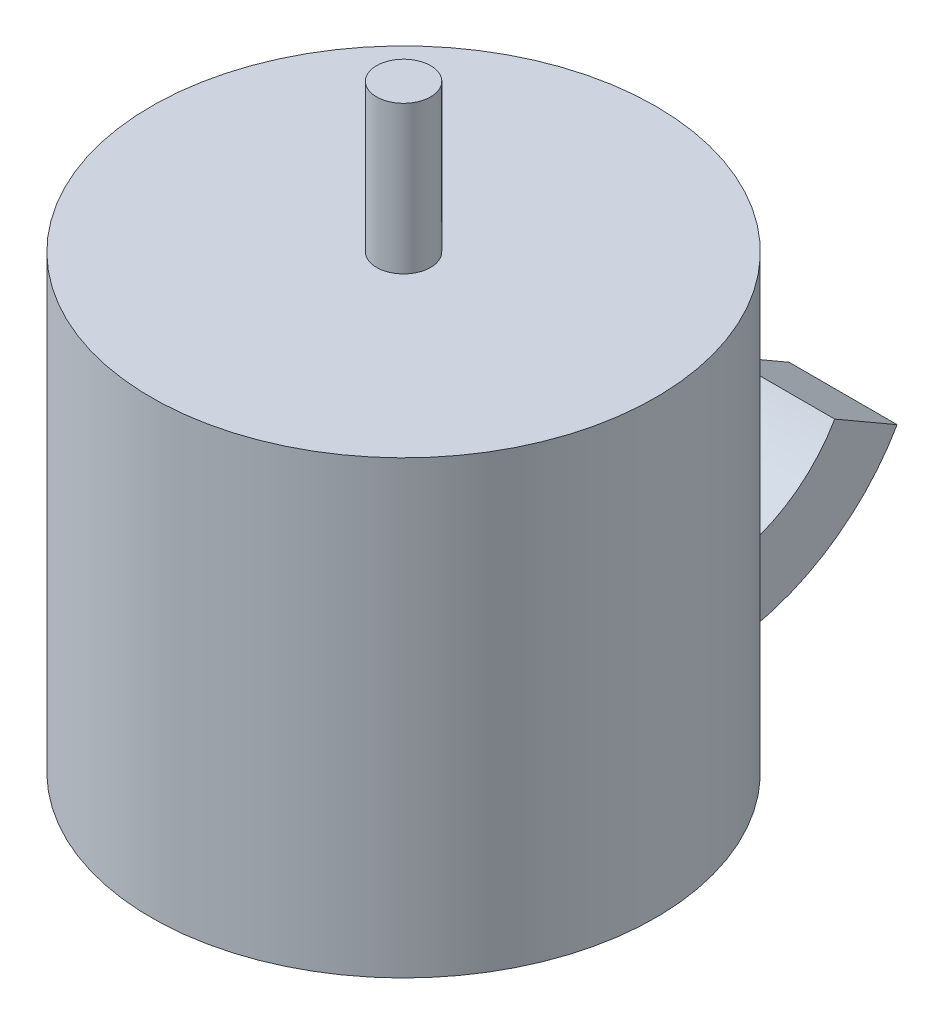
ISO-10303-21;
HEADER;
FILE_DESCRIPTION(('STEP AP214'),'2;1');
FILE_NAME('part.step','',(''),(''),'','','');
FILE_SCHEMA(('AUTOMOTIVE_DESIGN { 1 0 10303 214 1 1 1 1 }'));
ENDSEC;
DATA;
#1=APPLICATION_CONTEXT('core data for automotive mechanical design processes');
#2=APPLICATION_PROTOCOL_DEFINITION('international standard','automotive_design',2000,#1);
#3=PRODUCT_CONTEXT('',#1,'mechanical');
#4=PRODUCT('Part','Part','',(#3));
#5=PRODUCT_RELATED_PRODUCT_CATEGORY('part','',(#4));
#6=PRODUCT_DEFINITION_FORMATION('','',#4);
#7=PRODUCT_DEFINITION_CONTEXT('part definition',#1,'design');
#8=PRODUCT_DEFINITION('design','',#6,#7);
#9=PRODUCT_DEFINITION_SHAPE('','',#8);
#10=(LENGTH_UNIT() NAMED_UNIT(*) SI_UNIT(.MILLI.,.METRE.));
#11=(NAMED_UNIT(*) PLANE_ANGLE_UNIT() SI_UNIT($,.RADIAN.));
#12=(NAMED_UNIT(*) SI_UNIT($,.STERADIAN.) SOLID_ANGLE_UNIT());
#13=UNCERTAINTY_MEASURE_WITH_UNIT(LENGTH_MEASURE(1.E-05),#10,'distance_accuracy_value','');
#14=(GEOMETRIC_REPRESENTATION_CONTEXT(3) GLOBAL_UNCERTAINTY_ASSIGNED_CONTEXT((#13)) GLOBAL_UNIT_ASSIGNED_CONTEXT((#10,
#11,#12)) REPRESENTATION_CONTEXT('',''));
#15=CARTESIAN_POINT('',(0.,0.,0.));
#16=DIRECTION('',(0.,0.,1.));
#17=DIRECTION('',(1.,0.,0.));
#18=AXIS2_PLACEMENT_3D('',#15,#16,#17);
#19=CARTESIAN_POINT('',(0.,-74.4600238629983,0.));
#20=DIRECTION('',(0.,-1.,0.));
#21=DIRECTION('',(0.,0.,-1.));
#22=AXIS2_PLACEMENT_3D('',#19,#20,#21);
#23=CYLINDRICAL_SURFACE('',#22,7.);
#24=CARTESIAN_POINT('',(0.,12.5,0.));
#25=DIRECTION('',(0.,-1.,0.));
#26=DIRECTION('',(0.,0.,-1.));
#27=AXIS2_PLACEMENT_3D('',#24,#25,#26);
#28=CIRCLE('',#27,7.);
#29=CARTESIAN_POINT('',(0.,12.5,-7.));
#30=VERTEX_POINT('',#29);
#31=EDGE_CURVE('E188',#30,#30,#28,.T.);
#32=ORIENTED_EDGE('',*,*,#31,.T.);
#33=EDGE_LOOP('',(#32));
#34=FACE_BOUND('',#33,.T.);
#35=DIRECTION('',(0.,-1.,0.));
#36=VECTOR('',#35,1.);
#37=CARTESIAN_POINT('',(-1.50000000000001,-74.4600238629983,-6.83739716558867));
#38=LINE('',#37,#36);
#39=CARTESIAN_POINT('',(-1.5,0.00220371150858566,-6.83739716558867));
#40=VERTEX_POINT('',#39);
#41=CARTESIAN_POINT('',(-1.5,2.00330632669435,-6.83739716558867));
#42=VERTEX_POINT('',#41);
#43=EDGE_CURVE('E11',#40,#42,#38,.F.);
#44=ORIENTED_EDGE('',*,*,#43,.F.);
#45=CARTESIAN_POINT('',(0.,0.,-7.));
#46=CARTESIAN_POINT('',(-0.126160889957548,1.15670884863326E-05,-7.00000330281107));
#47=CARTESIAN_POINT('',(-0.252321405636509,-1.31835540449459E-08,-6.99658930692439));
#48=CARTESIAN_POINT('',(-0.503907516462989,1.74283427631537E-05,-6.98297141646527));
#49=CARTESIAN_POINT('',(-0.629334181886882,4.63321901920177E-05,-6.97278729209866));
#50=CARTESIAN_POINT('',(-0.87945634818018,0.000230697698201183,-6.94567351132282));
#51=CARTESIAN_POINT('',(-1.0041518487763,0.000386159406082058,-6.92874385239247));
#52=CARTESIAN_POINT('',(-1.25281128850812,0.00101116574864973,-6.88813414517374));
#53=CARTESIAN_POINT('',(-1.37677203385405,0.00148162498386925,-6.86443455550131));
#54=CARTESIAN_POINT('',(-1.5,0.00220371150858536,-6.83739716558867));
#55=B_SPLINE_CURVE_WITH_KNOTS('',3,(#45,#46,#47,#48,#49,#50,#51,#52,#53,#54),.UNSPECIFIED.,.F.,
.F.,(4,2,2,2,4),(0.,0.37843587985044,0.755771473218785,1.1331072076151,1.5115433212298),.UNSPECIFIED.);
#56=CARTESIAN_POINT('',(0.,0.,-7.));
#57=VERTEX_POINT('',#56);
#58=EDGE_CURVE('E160',#57,#40,#55,.T.);
#59=ORIENTED_EDGE('',*,*,#58,.F.);
#60=CARTESIAN_POINT('',(0.,0.,0.));
#61=DIRECTION('',(0.,-1.,0.));
#62=DIRECTION('',(0.,0.,-1.));
#63=AXIS2_PLACEMENT_3D('',#60,#61,#62);
#64=CIRCLE('',#63,7.);
#65=EDGE_CURVE('E208',#57,#57,#64,.T.);
#66=ORIENTED_EDGE('',*,*,#65,.F.);
#67=CARTESIAN_POINT('',(1.5,0.00220371150858479,-6.83739716558867));
#68=CARTESIAN_POINT('',(1.37677203385405,0.00148162498386977,-6.86443455550131));
#69=CARTESIAN_POINT('',(1.25281128850812,0.00101116574865044,-6.88813414517374));
#70=CARTESIAN_POINT('',(1.0041518487763,0.000386159406082552,-6.92874385239247));
#71=CARTESIAN_POINT('',(0.879456348180179,0.000230697698201269,-6.94567351132282));
#72=CARTESIAN_POINT('',(0.629334181886882,4.63321901918761E-05,-6.97278729209866));
#73=CARTESIAN_POINT('',(0.503907516462989,1.74283427631927E-05,-6.98297141646527));
#74=CARTESIAN_POINT('',(0.252321405636509,-1.31835536504651E-08,-6.99658930692439));
#75=CARTESIAN_POINT('',(0.126160889957548,1.15670884869019E-05,-7.00000330281107));
#76=CARTESIAN_POINT('',(0.,0.,-7.));
#77=B_SPLINE_CURVE_WITH_KNOTS('',3,(#67,#68,#69,#70,#71,#72,#73,#74,#75,#76),.UNSPECIFIED.,.F.,
.F.,(4,2,2,2,4),(0.,0.378436113614695,0.755771848011013,1.13310744137936,1.5115433212298),.UNSPECIFIED.);
#78=CARTESIAN_POINT('',(1.5,0.00220371150858479,-6.83739716558867));
#79=VERTEX_POINT('',#78);
#80=EDGE_CURVE('E120',#79,#57,#77,.T.);
#81=ORIENTED_EDGE('',*,*,#80,.F.);
#82=DIRECTION('',(0.,-1.,0.));
#83=VECTOR('',#82,1.);
#84=CARTESIAN_POINT('',(1.49999999999999,-74.4600238629983,-6.83739716558867));
#85=LINE('',#84,#83);
#86=CARTESIAN_POINT('',(1.5,2.00330632669435,-6.83739716558867));
#87=VERTEX_POINT('',#86);
#88=EDGE_CURVE('E68',#87,#79,#85,.T.);
#89=ORIENTED_EDGE('',*,*,#88,.F.);
#90=CARTESIAN_POINT('',(0.,10.,-7.));
#91=CARTESIAN_POINT('',(-0.168772809164749,10.0000005523878,-6.99999984996591));
#92=CARTESIAN_POINT('',(-0.337550551885274,10.0000141547519,-6.99389327636672));
#93=CARTESIAN_POINT('',(-0.674265763692597,9.99990207124392,-6.96949555824698));
#94=CARTESIAN_POINT('',(-0.842202993792885,9.99977634779153,-6.95120112683901));
#95=CARTESIAN_POINT('',(-1.17674598996997,9.99888504702296,-6.90245706066643));
#96=CARTESIAN_POINT('',(-1.34334723292399,9.99811782842839,-6.87197635155625));
#97=CARTESIAN_POINT('',(-1.673887815772,9.99511432403658,-6.79902553788022));
#98=CARTESIAN_POINT('',(-1.83782713669321,9.99287802777324,-6.75655534789935));
#99=CARTESIAN_POINT('',(-2.1888438800098,9.9852259173658,-6.65190062316687));
#100=CARTESIAN_POINT('',(-2.3752924999108,9.97934768400213,-6.58762255999807));
#101=CARTESIAN_POINT('',(-2.74194036904101,9.96178302751718,-6.44364475228686));
#102=CARTESIAN_POINT('',(-2.92213771116011,9.95009484830832,-6.36394034950031));
#103=CARTESIAN_POINT('',(-3.27418950506392,9.91815686491337,-6.19016373018162));
#104=CARTESIAN_POINT('',(-3.44606227024012,9.89792690373791,-6.09612513423304));
#105=CARTESIAN_POINT('',(-3.77999134233663,9.84571116190549,-5.89487771327176));
#106=CARTESIAN_POINT('',(-3.94205450972676,9.81373371028822,-5.78767825515429));
#107=CARTESIAN_POINT('',(-4.19593695160709,9.74936542142401,-5.60434634186958));
#108=CARTESIAN_POINT('',(-4.2913780238917,9.72159283591099,-5.53157082818056));
#109=CARTESIAN_POINT('',(-4.47704370516182,9.65922215541297,-5.38240096914678));
#110=CARTESIAN_POINT('',(-4.5672699419445,9.62462620536475,-5.30600776674888));
#111=CARTESIAN_POINT('',(-4.74189416345373,9.54781904251485,-5.15054346502124));
#112=CARTESIAN_POINT('',(-4.82629597852007,9.50561290171669,-5.07147417757483));
#113=CARTESIAN_POINT('',(-4.9887846836766,9.41286101166235,-4.91172128252504));
#114=CARTESIAN_POINT('',(-5.06687141849854,9.36231505744884,-4.83103763529037));
#115=CARTESIAN_POINT('',(-5.21694708970535,9.25181540608862,-4.66859804245883));
#116=CARTESIAN_POINT('',(-5.28886979917148,9.19177550755227,-4.5868392697734));
#117=CARTESIAN_POINT('',(-5.42535280778977,9.06233734701786,-4.42456649900271));
#118=CARTESIAN_POINT('',(-5.48991301490353,8.99293896805339,-4.34405251648941));
#119=CARTESIAN_POINT('',(-5.61138536949135,8.84480681478384,-4.18596355494664));
#120=CARTESIAN_POINT('',(-5.66830085338458,8.76607714140159,-4.10838730447479));
#121=CARTESIAN_POINT('',(-5.77443655333256,8.59956808157239,-3.95782374202753));
#122=CARTESIAN_POINT('',(-5.82365796851811,8.5117901088606,-3.88483571603344));
#123=CARTESIAN_POINT('',(-5.90803152317441,8.34094164168165,-3.75503346261375));
#124=CARTESIAN_POINT('',(-5.94418903911417,8.25898764712803,-3.697397695684));
#125=CARTESIAN_POINT('',(-6.01110202931933,8.08941227346083,-3.58758792374416));
#126=CARTESIAN_POINT('',(-6.0418578631146,8.00179127206837,-3.53541355532301));
#127=CARTESIAN_POINT('',(-6.09818891404238,7.82152918171838,-3.43733799969686));
#128=CARTESIAN_POINT('',(-6.12376452611626,7.72888847614743,-3.3914363343463));
#129=CARTESIAN_POINT('',(-6.16999694206009,7.53929775646137,-3.3065804590856));
#130=CARTESIAN_POINT('',(-6.19065379525103,7.44234778556735,-3.26762617951418));
#131=CARTESIAN_POINT('',(-6.22627030092859,7.25051571862743,-3.19921238735152));
#132=CARTESIAN_POINT('',(-6.24148660807612,7.15582814510278,-3.16933970541553));
#133=CARTESIAN_POINT('',(-6.26798277675507,6.9639460871109,-3.1166109555411));
#134=CARTESIAN_POINT('',(-6.27926135077155,6.86675079383254,-3.09375718285869));
#135=CARTESIAN_POINT('',(-6.29803878641153,6.67061211013733,-3.05535017342798));
#136=CARTESIAN_POINT('',(-6.3055391963961,6.57166945305753,-3.03979394619136));
#137=CARTESIAN_POINT('',(-6.31688995211207,6.37265266573861,-3.01613557719128));
#138=CARTESIAN_POINT('',(-6.32073893824398,6.27257812807009,-3.00803621200683));
#139=CARTESIAN_POINT('',(-6.32486217263997,6.07127711695942,-2.99935694565199));
#140=CARTESIAN_POINT('',(-6.32510938643477,5.97004763390633,-2.99883391167974));
#141=CARTESIAN_POINT('',(-6.32196332397574,5.76785928984963,-3.00546053966504));
#142=CARTESIAN_POINT('',(-6.31856869858216,5.66690054303616,-3.01261304506951));
#143=CARTESIAN_POINT('',(-6.30808034662417,5.46603745278453,-3.03451304153055));
#144=CARTESIAN_POINT('',(-6.30098784091764,5.36613277244508,-3.0492580259048));
#145=CARTESIAN_POINT('',(-6.28298454883971,5.16801760772482,-3.08618318842767));
#146=CARTESIAN_POINT('',(-6.27207236251411,5.06980775838479,-3.10836609252851));
#147=CARTESIAN_POINT('',(-6.24623053928531,4.87557762166069,-3.15997439440508));
#148=CARTESIAN_POINT('',(-6.23129076690767,4.77956353042713,-3.18941804779068));
#149=CARTESIAN_POINT('',(-6.19719439477318,4.59064581925614,-3.25517321828433));
#150=CARTESIAN_POINT('',(-6.17803624262658,4.49774335895683,-3.29148726304443));
#151=CARTESIAN_POINT('',(-6.13529237147301,4.31581357037366,-3.37048980417808));
#152=CARTESIAN_POINT('',(-6.11170931515018,4.22678395109217,-3.41317446389335));
#153=CARTESIAN_POINT('',(-6.05987452801622,4.05314186814785,-3.50437905964681));
#154=CARTESIAN_POINT('',(-6.03162111992607,3.96853100582602,-3.55290109036908));
#155=CARTESIAN_POINT('',(-5.97056729585278,3.80519451655666,-3.65455850145683));
#156=CARTESIAN_POINT('',(-5.93781788546951,3.72641630552033,-3.70763993092709));
#157=CARTESIAN_POINT('',(-5.86740632187949,3.57423398626466,-3.81809467948091));
#158=CARTESIAN_POINT('',(-5.82974240895437,3.50083181779502,-3.87546953274178));
#159=CARTESIAN_POINT('',(-5.7092409383548,3.28937457334866,-4.05276230122807));
#160=CARTESIAN_POINT('',(-5.61882444931914,3.15988007783073,-4.1779682734395));
#161=CARTESIAN_POINT('',(-5.41672046314013,2.92396708515994,-4.43694633108023));
#162=CARTESIAN_POINT('',(-5.30474894744552,2.81790266716967,-4.57081486283657));
#163=CARTESIAN_POINT('',(-5.06176698474049,2.63032819153592,-4.83850750331308));
#164=CARTESIAN_POINT('',(-4.93074809106439,2.5488290770498,-4.97233156578578));
#165=CARTESIAN_POINT('',(-4.69575386245833,2.42995759281295,-5.19299873226129));
#166=CARTESIAN_POINT('',(-4.59612723856624,2.38675513581029,-5.28145128090713));
#167=CARTESIAN_POINT('',(-4.38982481372099,2.30957740553871,-5.4541281492338));
#168=CARTESIAN_POINT('',(-4.28314685325305,2.2756049754528,-5.53835115956571));
#169=CARTESIAN_POINT('',(-4.06342357269252,2.21561994416554,-5.70152260423284));
#170=CARTESIAN_POINT('',(-3.95036738242325,2.18962144949935,-5.78046149993905));
#171=CARTESIAN_POINT('',(-3.71882151430317,2.14438111517804,-5.93207629813578));
#172=CARTESIAN_POINT('',(-3.60033050884157,2.12514093648244,-6.0047506577138));
#173=CARTESIAN_POINT('',(-3.32225591333481,2.08723110520538,-6.16404331215554));
#174=CARTESIAN_POINT('',(-3.16103920963419,2.07047650136484,-6.24827401619739));
#175=CARTESIAN_POINT('',(-2.83205777694117,2.04384485468282,-6.40410870504731));
#176=CARTESIAN_POINT('',(-2.66429116741512,2.03396980258363,-6.47570903051862));
#177=CARTESIAN_POINT('',(-2.32344710956082,2.01894678323747,-6.60566960063745));
#178=CARTESIAN_POINT('',(-2.1503678636704,2.01380043460841,-6.66402530655725));
#179=CARTESIAN_POINT('',(-1.80014349569399,2.00645577417953,-6.76703794245753));
#180=CARTESIAN_POINT('',(-1.62299868987033,2.00425723385326,-6.8116959341352));
#181=CARTESIAN_POINT('',(-1.26323564996585,2.00139761891136,-6.8875616339982));
#182=CARTESIAN_POINT('',(-1.08057547229369,2.00075861465147,-6.9185712285826));
#183=CARTESIAN_POINT('',(-0.713370386014866,2.00007393756126,-6.96601584692984));
#184=CARTESIAN_POINT('',(-0.528825454967305,2.00002827180383,-6.98245069695277));
#185=CARTESIAN_POINT('',(-0.159012843766465,1.99998959399869,-7.0006418964186));
#186=CARTESIAN_POINT('',(0.0262548355848166,1.99999658189258,-7.00239826214484));
#187=CARTESIAN_POINT('',(0.396347311583818,2.00000596191504,-6.99122197799655));
#188=CARTESIAN_POINT('',(0.581172099747225,2.00000835395625,-6.97828904894325));
#189=CARTESIAN_POINT('',(0.960809482976416,2.00044491304537,-6.93653858746798));
#190=CARTESIAN_POINT('',(1.15551842475297,2.00090625020397,-6.90677238999273));
#191=CARTESIAN_POINT('',(1.54175507180937,2.00339461138826,-6.8309390527949));
#192=CARTESIAN_POINT('',(1.73328233425758,2.00542185152462,-6.78486966354022));
#193=CARTESIAN_POINT('',(2.11171900437515,2.0127126373691,-6.67677825585862));
#194=CARTESIAN_POINT('',(2.29862853839762,2.01797609442364,-6.61475667445638));
#195=CARTESIAN_POINT('',(2.66633786844443,2.03394425583584,-6.47528185089832));
#196=CARTESIAN_POINT('',(2.84713946423919,2.04464734216731,-6.39783320171095));
#197=CARTESIAN_POINT('',(3.15823094660273,2.07062777904778,-6.2488172721431));
#198=CARTESIAN_POINT('',(3.29016143847929,2.08417272347834,-6.18035792856145));
#199=CARTESIAN_POINT('',(3.54882270399237,2.11730181790047,-6.0355454725629));
#200=CARTESIAN_POINT('',(3.6755546128963,2.13688464129793,-5.95919409656693));
#201=CARTESIAN_POINT('',(3.92277858413732,2.18351565384184,-5.79943391371322));
#202=CARTESIAN_POINT('',(4.0432804814258,2.21055162148795,-5.71603681422296));
#203=CARTESIAN_POINT('',(4.27731243981863,2.27362741669522,-5.54308097754108));
#204=CARTESIAN_POINT('',(4.39084420320695,2.30966503483921,-5.45352375622822));
#205=CARTESIAN_POINT('',(4.58595963419521,2.38319930274952,-5.28975152176345));
#206=CARTESIAN_POINT('',(4.66909832931066,2.41865141356751,-5.21646712611937));
#207=CARTESIAN_POINT('',(4.83002724780604,2.49661171903676,-5.06782250781644));
#208=CARTESIAN_POINT('',(4.90781878026242,2.53911817790013,-4.99246279960278));
#209=CARTESIAN_POINT('',(5.05759054134707,2.63173348128945,-4.84067591868955));
#210=CARTESIAN_POINT('',(5.12957232939836,2.68184027530382,-4.7642490389389));
#211=CARTESIAN_POINT('',(5.26734740997393,2.79006642456735,-4.61146746346632));
#212=CARTESIAN_POINT('',(5.33314063578951,2.848185866171,-4.53511276853127));
#213=CARTESIAN_POINT('',(5.45867798042796,2.9730882044983,-4.38321955733735));
#214=CARTESIAN_POINT('',(5.5183750175111,3.03993059653146,-4.30769090796679));
#215=CARTESIAN_POINT('',(5.63098311076777,3.18191764058279,-4.15941091786286));
#216=CARTESIAN_POINT('',(5.68389403874544,3.25706244939139,-4.08665962961464));
#217=CARTESIAN_POINT('',(5.78287332102291,3.41535449756689,-3.94535420975129));
#218=CARTESIAN_POINT('',(5.82894289449713,3.49850030674002,-3.87679933159128));
#219=CARTESIAN_POINT('',(5.91434678637656,3.6722827305267,-3.74521795222048));
#220=CARTESIAN_POINT('',(5.9536818250698,3.76291854251224,-3.68219086014083));
#221=CARTESIAN_POINT('',(6.02158441096636,3.93985913053765,-3.56991678782821));
#222=CARTESIAN_POINT('',(6.05087472223495,4.02541408938187,-3.51992127116284));
#223=CARTESIAN_POINT('',(6.10461404718473,4.20122973865337,-3.42587549960009));
#224=CARTESIAN_POINT('',(6.12906141051524,4.2914920200222,-3.38182727300717));
#225=CARTESIAN_POINT('',(6.17332737249153,4.47598842038671,-3.30033033310824));
#226=CARTESIAN_POINT('',(6.19314803351989,4.57022074751073,-3.26287868117057));
#227=CARTESIAN_POINT('',(6.22842100105837,4.76202680152655,-3.19503295673134));
#228=CARTESIAN_POINT('',(6.24387167506157,4.85960176191349,-3.16464152248822));
#229=CARTESIAN_POINT('',(6.27023833616245,5.05455210989368,-3.11206552157358));
#230=CARTESIAN_POINT('',(6.28126924336509,5.15185649748228,-3.0896748792314));
#231=CARTESIAN_POINT('',(6.29956973692769,5.34824518189995,-3.05218888951007));
#232=CARTESIAN_POINT('',(6.3068379746319,5.44733010377829,-3.03709615805293));
#233=CARTESIAN_POINT('',(6.31772233974805,5.64651459915549,-3.01438935313325));
#234=CARTESIAN_POINT('',(6.32133979531289,5.74661379026797,-3.00677255995543));
#235=CARTESIAN_POINT('',(6.3249888828364,5.94720359844023,-2.99908882415688));
#236=CARTESIAN_POINT('',(6.32501918276018,6.04769434704701,-2.99902468609813));
#237=CARTESIAN_POINT('',(6.32147396974647,6.24930942565156,-3.00649035831947));
#238=CARTESIAN_POINT('',(6.31786339397884,6.35043041565752,-3.01409401198577));
#239=CARTESIAN_POINT('',(6.30691947811082,6.55164267921867,-3.03692717731206));
#240=CARTESIAN_POINT('',(6.29958475424925,6.65173355590625,-3.0521595234946));
#241=CARTESIAN_POINT('',(6.28107430239278,6.85009429763081,-3.09007278450548));
#242=CARTESIAN_POINT('',(6.26990006154306,6.94836485221754,-3.11275081527474));
#243=CARTESIAN_POINT('',(6.24353558458578,7.14245042663586,-3.16530050110784));
#244=CARTESIAN_POINT('',(6.22834388541416,7.2382645379158,-3.19517477652119));
#245=CARTESIAN_POINT('',(6.19376712402429,7.42653858990994,-3.26169428520393));
#246=CARTESIAN_POINT('',(6.17438980744516,7.51900436266206,-3.29832699371624));
#247=CARTESIAN_POINT('',(6.13120586083118,7.70010844340895,-3.37792309522866));
#248=CARTESIAN_POINT('',(6.10739761425969,7.7887453399265,-3.42088879750173));
#249=CARTESIAN_POINT('',(6.02899529846044,8.04782591072821,-3.55841986448443));
#250=CARTESIAN_POINT('',(5.96737791883721,8.21169922598377,-3.66171252133693));
#251=CARTESIAN_POINT('',(5.82476247358577,8.51574387645708,-3.88450692980079));
#252=CARTESIAN_POINT('',(5.74395350500645,8.65612500925767,-4.00384588603544));
#253=CARTESIAN_POINT('',(5.56223288460265,8.91275783541776,-4.25267573734221));
#254=CARTESIAN_POINT('',(5.46131999895083,9.02900804690807,-4.38216725520631));
#255=CARTESIAN_POINT('',(5.23666827946784,9.24042847265061,-4.64850695467395));
#256=CARTESIAN_POINT('',(5.11229034465964,9.33478400902132,-4.78545719405365));
#257=CARTESIAN_POINT('',(4.84509355614454,9.49931630274559,-5.05580826580838));
#258=CARTESIAN_POINT('',(4.70226614634728,9.56948178602846,-5.18920741650062));
#259=CARTESIAN_POINT('',(4.44309469308645,9.67229187623547,-5.41104590518801));
#260=CARTESIAN_POINT('',(4.3304940952223,9.7099426075955,-5.50163708473976));
#261=CARTESIAN_POINT('',(4.09810433817893,9.77598445472761,-5.67685692994023));
#262=CARTESIAN_POINT('',(3.9783125788607,9.80437219707344,-5.76148341456966));
#263=CARTESIAN_POINT('',(3.73225566121129,9.85345664348534,-5.9238551599951));
#264=CARTESIAN_POINT('',(3.60597569221503,9.874134772638,-6.00158346224706));
#265=CARTESIAN_POINT('',(3.34808896969933,9.9092008794314,-6.14917720027492));
#266=CARTESIAN_POINT('',(3.21648223176186,9.92358887547067,-6.21904265904908));
#267=CARTESIAN_POINT('',(2.91301331194685,9.95064515163397,-6.36788941305695));
#268=CARTESIAN_POINT('',(2.73977205268439,9.96183263413111,-6.44433620292907));
#269=CARTESIAN_POINT('',(2.38740461103326,9.97882022106839,-6.58302191277532));
#270=CARTESIAN_POINT('',(2.20827643328357,9.98461847892831,-6.64525595734609));
#271=CARTESIAN_POINT('',(1.84577675747337,9.99286284723879,-6.75491765371547));
#272=CARTESIAN_POINT('',(1.66241215642296,9.99531406274649,-6.8023677690966));
#273=CARTESIAN_POINT('',(1.29250961431407,9.99846642762964,-6.88223808344377));
#274=CARTESIAN_POINT('',(1.10597320007938,9.99916839630352,-6.91466531291442));
#275=CARTESIAN_POINT('',(0.766213652265961,9.99984568738104,-6.95963396342215));
#276=CARTESIAN_POINT('',(0.613328312175802,9.9999329061136,-6.97476942380454));
#277=CARTESIAN_POINT('',(0.306963129006843,10.0000097879729,-6.99495010347015));
#278=CARTESIAN_POINT('',(0.153483604592208,9.9999994976533,-7.00000013644244));
#279=CARTESIAN_POINT('',(0.,10.,-7.));
#280=B_SPLINE_CURVE_WITH_KNOTS('',3,(#90,#91,#92,#93,#94,#95,#96,#97,#98,#99,#100,#101,#102,
#103,#104,#105,#106,#107,#108,#109,#110,#111,#112,#113,#114,#115,#116,#117,#118,#119,#120,#121,
#122,#123,#124,#125,#126,#127,#128,#129,#130,#131,#132,#133,#134,#135,#136,#137,#138,#139,#140,
#141,#142,#143,#144,#145,#146,#147,#148,#149,#150,#151,#152,#153,#154,#155,#156,#157,#158,#159,
#160,#161,#162,#163,#164,#165,#166,#167,#168,#169,#170,#171,#172,#173,#174,#175,#176,#177,#178,
#179,#180,#181,#182,#183,#184,#185,#186,#187,#188,#189,#190,#191,#192,#193,#194,#195,#196,#197,
#198,#199,#200,#201,#202,#203,#204,#205,#206,#207,#208,#209,#210,#211,#212,#213,#214,#215,#216,
#217,#218,#219,#220,#221,#222,#223,#224,#225,#226,#227,#228,#229,#230,#231,#232,#233,#234,#235,
#236,#237,#238,#239,#240,#241,#242,#243,#244,#245,#246,#247,#248,#249,#250,#251,#252,#253,#254,
#255,#256,#257,#258,#259,#260,#261,#262,#263,#264,#265,#266,#267,#268,#269,#270,#271,#272,#273,
#274,#275,#276,#277,#278,#279),.UNSPECIFIED.,.T.,.F.,(4,2,2,2,2,2,2,2,2,2,2,2,2,2,2,2,2,2,2,2,2,
2,2,2,2,2,2,2,2,2,2,2,2,2,2,2,2,2,2,2,2,2,2,2,2,2,2,2,2,2,2,2,2,2,2,2,2,2,2,2,2,2,2,2,2,2,2,2,2,
2,2,2,2,2,2,2,2,2,2,2,2,2,2,2,2,2,2,2,2,2,2,2,2,2,4),(0.,0.506216479638758,1.01256953376996,
1.5202220808886,2.02787824469862,2.61902375283099,3.21034804663962,3.8003061556864,
4.38984678570829,4.75912302178952,5.12828335971556,5.49719856477694,5.86612283756406,
6.23861263935542,6.61110709712026,6.98343845361094,7.35571172378635,7.67484680193999,
7.99396063076679,8.31305012111167,8.63213641177344,8.9331273810429,9.23421667293323,
9.53518247230426,9.83626029168358,10.1395968105284,10.4430457409045,10.7463945507763,
11.0498546578779,11.3540856724495,11.6584288335887,11.9625894403172,12.2668595195302,
12.5679260582887,12.869100696221,13.4707568267806,14.080962966913,14.6914405364749,
15.1110881174903,15.5308648189966,15.9513799120179,16.3719982808653,16.9192276569353,
17.4666153195783,18.014190281292,18.5617227902437,19.1169601015789,19.6722040315953,
20.227447345661,20.782701212632,21.3729074778841,21.9631952122102,22.5534667767937,
23.143562866852,23.5909392812552,24.0382174716779,24.4847665437264,24.9312061197029,
25.2799632115149,25.6286346152916,25.9772121169919,26.3257933757014,26.6768902700751,
27.0279937960171,27.3790346777198,27.7300379905735,28.0396462456886,28.3493598264314,
28.6589350855708,28.9686258412165,29.2696400058279,29.5707619885444,29.871774383686,
30.172898554785,30.4769506102426,30.7811157234124,31.085163158047,31.3893214724707,
31.6929216804353,31.996632868799,32.6032267682831,33.2040751592936,33.8049604372291,
34.4255167993716,35.0463619896646,35.4938226005758,35.941445987781,36.390140977993,
36.8388346557699,37.4071350885855,37.9756301738737,38.5432571930827,39.1106183016198,
39.5711962856005,40.0315543870236),.UNSPECIFIED.);
#281=EDGE_CURVE('E54',#42,#87,#280,.T.);
#282=ORIENTED_EDGE('',*,*,#281,.F.);
#283=EDGE_LOOP('',(#44,#59,#66,#81,#89,#282));
#284=FACE_BOUND('',#283,.T.);
#285=ADVANCED_FACE('F45',(#34,#284),#23,.T.);
#286=CARTESIAN_POINT('',(-7.,12.5,0.));
#287=DIRECTION('',(0.,-1.,0.));
#288=DIRECTION('',(0.,0.,-1.));
#289=AXIS2_PLACEMENT_3D('',#286,#287,#288);
#290=PLANE('',#289);
#291=ORIENTED_EDGE('',*,*,#31,.F.);
#292=EDGE_LOOP('',(#291));
#293=FACE_BOUND('',#292,.T.);
#294=CARTESIAN_POINT('',(0.,12.5,0.));
#295=DIRECTION('',(0.,-1.,0.));
#296=DIRECTION('',(0.,0.,-1.));
#297=AXIS2_PLACEMENT_3D('',#294,#295,#296);
#298=CIRCLE('',#297,0.75);
#299=CARTESIAN_POINT('',(0.,12.5,-0.75));
#300=VERTEX_POINT('',#299);
#301=EDGE_CURVE('E192',#300,#300,#298,.T.);
#302=ORIENTED_EDGE('',*,*,#301,.T.);
#303=EDGE_LOOP('',(#302));
#304=FACE_BOUND('',#303,.T.);
#305=ADVANCED_FACE('F265',(#293,#304),#290,.F.);
#306=CARTESIAN_POINT('',(0.,-74.4600238629983,0.));
#307=DIRECTION('',(0.,-1.,0.));
#308=DIRECTION('',(0.,0.,-1.));
#309=AXIS2_PLACEMENT_3D('',#306,#307,#308);
#310=CYLINDRICAL_SURFACE('',#309,0.75);
#311=ORIENTED_EDGE('',*,*,#301,.F.);
#312=EDGE_LOOP('',(#311));
#313=FACE_BOUND('',#312,.T.);
#314=CARTESIAN_POINT('',(0.,16.6,0.));
#315=DIRECTION('',(0.,-1.,0.));
#316=DIRECTION('',(0.,0.,-1.));
#317=AXIS2_PLACEMENT_3D('',#314,#315,#316);
#318=CIRCLE('',#317,0.75);
#319=CARTESIAN_POINT('',(0.,16.6,-0.75));
#320=VERTEX_POINT('',#319);
#321=EDGE_CURVE('E196',#320,#320,#318,.T.);
#322=ORIENTED_EDGE('',*,*,#321,.T.);
#323=EDGE_LOOP('',(#322));
#324=FACE_BOUND('',#323,.T.);
#325=ADVANCED_FACE('F270',(#313,#324),#310,.T.);
#326=CARTESIAN_POINT('',(-0.75,16.6,0.));
#327=DIRECTION('',(0.,-1.,0.));
#328=DIRECTION('',(0.,0.,-1.));
#329=AXIS2_PLACEMENT_3D('',#326,#327,#328);
#330=PLANE('',#329);
#331=ORIENTED_EDGE('',*,*,#321,.F.);
#332=EDGE_LOOP('',(#331));
#333=FACE_BOUND('',#332,.T.);
#334=ADVANCED_FACE('F278',(#333),#330,.F.);
#335=CARTESIAN_POINT('',(-0.750000000000001,-0.900000000000001,0.));
#336=DIRECTION('',(0.,1.,0.));
#337=DIRECTION('',(0.,0.,1.));
#338=AXIS2_PLACEMENT_3D('',#335,#336,#337);
#339=PLANE('',#338);
#340=CARTESIAN_POINT('',(0.,-0.899999999999998,0.));
#341=DIRECTION('',(0.,-1.,0.));
#342=DIRECTION('',(0.,0.,-1.));
#343=AXIS2_PLACEMENT_3D('',#340,#341,#342);
#344=CIRCLE('',#343,0.750000000000001);
#345=CARTESIAN_POINT('',(0.,-0.899999999999998,-0.750000000000001));
#346=VERTEX_POINT('',#345);
#347=EDGE_CURVE('E200',#346,#346,#344,.T.);
#348=ORIENTED_EDGE('',*,*,#347,.T.);
#349=EDGE_LOOP('',(#348));
#350=FACE_BOUND('',#349,.T.);
#351=ADVANCED_FACE('F260',(#350),#339,.F.);
#352=CARTESIAN_POINT('',(0.,-74.4600238629983,0.));
#353=DIRECTION('',(0.,-1.,0.));
#354=DIRECTION('',(0.,0.,-1.));
#355=AXIS2_PLACEMENT_3D('',#352,#353,#354);
#356=CYLINDRICAL_SURFACE('',#355,0.75);
#357=ORIENTED_EDGE('',*,*,#347,.F.);
#358=EDGE_LOOP('',(#357));
#359=FACE_BOUND('',#358,.T.);
#360=CARTESIAN_POINT('',(0.,0.,0.));
#361=DIRECTION('',(0.,-1.,0.));
#362=DIRECTION('',(0.,0.,-1.));
#363=AXIS2_PLACEMENT_3D('',#360,#361,#362);
#364=CIRCLE('',#363,0.75);
#365=CARTESIAN_POINT('',(0.,0.,-0.75));
#366=VERTEX_POINT('',#365);
#367=EDGE_CURVE('E204',#366,#366,#364,.T.);
#368=ORIENTED_EDGE('',*,*,#367,.T.);
#369=EDGE_LOOP('',(#368));
#370=FACE_BOUND('',#369,.T.);
#371=ADVANCED_FACE('F250',(#359,#370),#356,.T.);
#372=CARTESIAN_POINT('',(-0.75,0.,0.));
#373=DIRECTION('',(0.,1.,0.));
#374=DIRECTION('',(0.,0.,1.));
#375=AXIS2_PLACEMENT_3D('',#372,#373,#374);
#376=PLANE('',#375);
#377=CARTESIAN_POINT('',(-3.18198051533948,0.,3.18198051533945));
#378=DIRECTION('',(0.,-1.,0.));
#379=DIRECTION('',(0.,0.,-1.));
#380=AXIS2_PLACEMENT_3D('',#377,#378,#379);
#381=CIRCLE('',#380,0.799999999999999);
#382=CARTESIAN_POINT('',(-3.18198051533948,0.,2.38198051533945));
#383=VERTEX_POINT('',#382);
#384=EDGE_CURVE('E238',#383,#383,#381,.T.);
#385=ORIENTED_EDGE('',*,*,#384,.F.);
#386=EDGE_LOOP('',(#385));
#387=FACE_BOUND('',#386,.T.);
#388=CARTESIAN_POINT('',(3.18198051533945,0.,3.18198051533948));
#389=DIRECTION('',(0.,-1.,0.));
#390=DIRECTION('',(0.,0.,-1.));
#391=AXIS2_PLACEMENT_3D('',#388,#389,#390);
#392=CIRCLE('',#391,0.799999999999999);
#393=CARTESIAN_POINT('',(3.18198051533945,0.,2.38198051533948));
#394=VERTEX_POINT('',#393);
#395=EDGE_CURVE('E231',#394,#394,#392,.T.);
#396=ORIENTED_EDGE('',*,*,#395,.F.);
#397=EDGE_LOOP('',(#396));
#398=FACE_BOUND('',#397,.T.);
#399=CARTESIAN_POINT('',(3.18198051533948,0.,-3.18198051533944));
#400=DIRECTION('',(0.,-1.,0.));
#401=DIRECTION('',(0.,0.,-1.));
#402=AXIS2_PLACEMENT_3D('',#399,#400,#401);
#403=CIRCLE('',#402,0.799999999999999);
#404=CARTESIAN_POINT('',(3.18198051533948,0.,-3.98198051533944));
#405=VERTEX_POINT('',#404);
#406=EDGE_CURVE('E223',#405,#405,#403,.T.);
#407=ORIENTED_EDGE('',*,*,#406,.F.);
#408=EDGE_LOOP('',(#407));
#409=FACE_BOUND('',#408,.T.);
#410=CARTESIAN_POINT('',(-3.18198051533945,0.,-3.18198051533948));
#411=DIRECTION('',(0.,-1.,0.));
#412=DIRECTION('',(0.,0.,-1.));
#413=AXIS2_PLACEMENT_3D('',#410,#411,#412);
#414=CIRCLE('',#413,0.799999999999999);
#415=CARTESIAN_POINT('',(-3.18198051533945,0.,-3.98198051533948));
#416=VERTEX_POINT('',#415);
#417=EDGE_CURVE('E215',#416,#416,#414,.T.);
#418=ORIENTED_EDGE('',*,*,#417,.F.);
#419=EDGE_LOOP('',(#418));
#420=FACE_BOUND('',#419,.T.);
#421=ORIENTED_EDGE('',*,*,#367,.F.);
#422=EDGE_LOOP('',(#421));
#423=FACE_BOUND('',#422,.T.);
#424=ORIENTED_EDGE('',*,*,#65,.T.);
#425=EDGE_LOOP('',(#424));
#426=FACE_BOUND('',#425,.T.);
#427=ADVANCED_FACE('F247',(#387,#398,#409,#420,#423,#426),#376,.F.);
#428=CARTESIAN_POINT('',(-3.18198051533945,5.2,-3.18198051533948));
#429=DIRECTION('',(0.,-1.,0.));
#430=DIRECTION('',(0.,0.,-1.));
#431=AXIS2_PLACEMENT_3D('',#428,#429,#430);
#432=CONICAL_SURFACE('',#431,0.799999999999999,1.02974425867665);
#433=CARTESIAN_POINT('',(-3.18198051533945,5.68068849522205,-3.18198051533948));
#434=VERTEX_POINT('',#433);
#435=VERTEX_LOOP('',#434);
#436=FACE_BOUND('',#435,.T.);
#437=CARTESIAN_POINT('',(-3.18198051533945,5.2,-3.18198051533948));
#438=DIRECTION('',(0.,-1.,0.));
#439=DIRECTION('',(0.,0.,-1.));
#440=AXIS2_PLACEMENT_3D('',#437,#438,#439);
#441=CIRCLE('',#440,0.799999999999999);
#442=CARTESIAN_POINT('',(-3.18198051533945,5.2,-3.98198051533948));
#443=VERTEX_POINT('',#442);
#444=EDGE_CURVE('E212',#443,#443,#441,.T.);
#445=ORIENTED_EDGE('',*,*,#444,.T.);
#446=EDGE_LOOP('',(#445));
#447=FACE_BOUND('',#446,.T.);
#448=ADVANCED_FACE('F249',(#436,#447),#432,.F.);
#449=CARTESIAN_POINT('',(-3.18198051533945,0.,-3.18198051533948));
#450=DIRECTION('',(0.,-1.,0.));
#451=DIRECTION('',(0.,0.,-1.));
#452=AXIS2_PLACEMENT_3D('',#449,#450,#451);
#453=CYLINDRICAL_SURFACE('',#452,0.799999999999999);
#454=ORIENTED_EDGE('',*,*,#444,.F.);
#455=EDGE_LOOP('',(#454));
#456=FACE_BOUND('',#455,.T.);
#457=ORIENTED_EDGE('',*,*,#417,.T.);
#458=EDGE_LOOP('',(#457));
#459=FACE_BOUND('',#458,.T.);
#460=ADVANCED_FACE('F257',(#456,#459),#453,.F.);
#461=CARTESIAN_POINT('',(3.18198051533948,5.2,-3.18198051533944));
#462=DIRECTION('',(0.,-1.,0.));
#463=DIRECTION('',(0.,0.,-1.));
#464=AXIS2_PLACEMENT_3D('',#461,#462,#463);
#465=CONICAL_SURFACE('',#464,0.799999999999999,1.02974425867665);
#466=CARTESIAN_POINT('',(3.18198051533948,5.68068849522205,-3.18198051533944));
#467=VERTEX_POINT('',#466);
#468=VERTEX_LOOP('',#467);
#469=FACE_BOUND('',#468,.T.);
#470=CARTESIAN_POINT('',(3.18198051533948,5.2,-3.18198051533944));
#471=DIRECTION('',(0.,-1.,0.));
#472=DIRECTION('',(0.,0.,-1.));
#473=AXIS2_PLACEMENT_3D('',#470,#471,#472);
#474=CIRCLE('',#473,0.799999999999999);
#475=CARTESIAN_POINT('',(3.18198051533948,5.2,-3.98198051533944));
#476=VERTEX_POINT('',#475);
#477=EDGE_CURVE('E219',#476,#476,#474,.T.);
#478=ORIENTED_EDGE('',*,*,#477,.T.);
#479=EDGE_LOOP('',(#478));
#480=FACE_BOUND('',#479,.T.);
#481=ADVANCED_FACE('F316',(#469,#480),#465,.F.);
#482=CARTESIAN_POINT('',(3.18198051533948,0.,-3.18198051533944));
#483=DIRECTION('',(0.,-1.,0.));
#484=DIRECTION('',(0.,0.,-1.));
#485=AXIS2_PLACEMENT_3D('',#482,#483,#484);
#486=CYLINDRICAL_SURFACE('',#485,0.799999999999999);
#487=ORIENTED_EDGE('',*,*,#477,.F.);
#488=EDGE_LOOP('',(#487));
#489=FACE_BOUND('',#488,.T.);
#490=ORIENTED_EDGE('',*,*,#406,.T.);
#491=EDGE_LOOP('',(#490));
#492=FACE_BOUND('',#491,.T.);
#493=ADVANCED_FACE('F329',(#489,#492),#486,.F.);
#494=CARTESIAN_POINT('',(3.18198051533945,5.2,3.18198051533948));
#495=DIRECTION('',(0.,-1.,0.));
#496=DIRECTION('',(0.,0.,-1.));
#497=AXIS2_PLACEMENT_3D('',#494,#495,#496);
#498=CONICAL_SURFACE('',#497,0.799999999999999,1.02974425867665);
#499=CARTESIAN_POINT('',(3.18198051533944,5.68068849522205,3.18198051533948));
#500=VERTEX_POINT('',#499);
#501=VERTEX_LOOP('',#500);
#502=FACE_BOUND('',#501,.T.);
#503=CARTESIAN_POINT('',(3.18198051533945,5.2,3.18198051533948));
#504=DIRECTION('',(0.,-1.,0.));
#505=DIRECTION('',(0.,0.,-1.));
#506=AXIS2_PLACEMENT_3D('',#503,#504,#505);
#507=CIRCLE('',#506,0.799999999999999);
#508=CARTESIAN_POINT('',(3.18198051533945,5.2,2.38198051533948));
#509=VERTEX_POINT('',#508);
#510=EDGE_CURVE('E227',#509,#509,#507,.T.);
#511=ORIENTED_EDGE('',*,*,#510,.T.);
#512=EDGE_LOOP('',(#511));
#513=FACE_BOUND('',#512,.T.);
#514=ADVANCED_FACE('F339',(#502,#513),#498,.F.);
#515=CARTESIAN_POINT('',(3.18198051533945,0.,3.18198051533948));
#516=DIRECTION('',(0.,-1.,0.));
#517=DIRECTION('',(0.,0.,-1.));
#518=AXIS2_PLACEMENT_3D('',#515,#516,#517);
#519=CYLINDRICAL_SURFACE('',#518,0.799999999999999);
#520=ORIENTED_EDGE('',*,*,#510,.F.);
#521=EDGE_LOOP('',(#520));
#522=FACE_BOUND('',#521,.T.);
#523=ORIENTED_EDGE('',*,*,#395,.T.);
#524=EDGE_LOOP('',(#523));
#525=FACE_BOUND('',#524,.T.);
#526=ADVANCED_FACE('F351',(#522,#525),#519,.F.);
#527=CARTESIAN_POINT('',(-3.18198051533948,5.2,3.18198051533945));
#528=DIRECTION('',(0.,-1.,0.));
#529=DIRECTION('',(0.,0.,-1.));
#530=AXIS2_PLACEMENT_3D('',#527,#528,#529);
#531=CONICAL_SURFACE('',#530,0.799999999999999,1.02974425867665);
#532=CARTESIAN_POINT('',(-3.18198051533948,5.68068849522205,3.18198051533945));
#533=VERTEX_POINT('',#532);
#534=VERTEX_LOOP('',#533);
#535=FACE_BOUND('',#534,.T.);
#536=CARTESIAN_POINT('',(-3.18198051533948,5.2,3.18198051533945));
#537=DIRECTION('',(0.,-1.,0.));
#538=DIRECTION('',(0.,0.,-1.));
#539=AXIS2_PLACEMENT_3D('',#536,#537,#538);
#540=CIRCLE('',#539,0.799999999999999);
#541=CARTESIAN_POINT('',(-3.18198051533948,5.2,2.38198051533945));
#542=VERTEX_POINT('',#541);
#543=EDGE_CURVE('E235',#542,#542,#540,.T.);
#544=ORIENTED_EDGE('',*,*,#543,.T.);
#545=EDGE_LOOP('',(#544));
#546=FACE_BOUND('',#545,.T.);
#547=ADVANCED_FACE('F361',(#535,#546),#531,.F.);
#548=CARTESIAN_POINT('',(-3.18198051533948,0.,3.18198051533945));
#549=DIRECTION('',(0.,-1.,0.));
#550=DIRECTION('',(0.,0.,-1.));
#551=AXIS2_PLACEMENT_3D('',#548,#549,#550);
#552=CYLINDRICAL_SURFACE('',#551,0.799999999999999);
#553=ORIENTED_EDGE('',*,*,#543,.F.);
#554=EDGE_LOOP('',(#553));
#555=FACE_BOUND('',#554,.T.);
#556=ORIENTED_EDGE('',*,*,#384,.T.);
#557=EDGE_LOOP('',(#556));
#558=FACE_BOUND('',#557,.T.);
#559=ADVANCED_FACE('F180',(#555,#558),#552,.F.);
#560=CARTESIAN_POINT('',(-1.5,3.00000000000001,-12.1961524227066));
#561=DIRECTION('',(1.,0.,0.));
#562=DIRECTION('',(0.,1.,0.));
#563=AXIS2_PLACEMENT_3D('',#560,#561,#562);
#564=PLANE('',#563);
#565=CARTESIAN_POINT('',(-1.5,6.,-7.));
#566=DIRECTION('',(-1.,0.,0.));
#567=DIRECTION('',(0.,-1.,0.));
#568=AXIS2_PLACEMENT_3D('',#565,#566,#567);
#569=CIRCLE('',#568,6.);
#570=CARTESIAN_POINT('',(-1.5,3.00000000000001,-12.1961524227066));
#571=VERTEX_POINT('',#570);
#572=EDGE_CURVE('E144',#571,#40,#569,.T.);
#573=ORIENTED_EDGE('',*,*,#572,.T.);
#574=ORIENTED_EDGE('',*,*,#43,.T.);
#575=CARTESIAN_POINT('',(-1.5,6.,-7.));
#576=DIRECTION('',(-1.,0.,0.));
#577=DIRECTION('',(0.,-1.,0.));
#578=AXIS2_PLACEMENT_3D('',#575,#576,#577);
#579=CIRCLE('',#578,4.);
#580=CARTESIAN_POINT('',(-1.5,4.00000000000001,-10.4641016151378));
#581=VERTEX_POINT('',#580);
#582=EDGE_CURVE('E111',#581,#42,#579,.T.);
#583=ORIENTED_EDGE('',*,*,#582,.F.);
#584=DIRECTION('',(0.,0.499999999999998,0.86602540378444));
#585=VECTOR('',#584,1.);
#586=CARTESIAN_POINT('',(-1.5,3.00000000000001,-12.1961524227066));
#587=LINE('',#586,#585);
#588=EDGE_CURVE('E115',#571,#581,#587,.T.);
#589=ORIENTED_EDGE('',*,*,#588,.F.);
#590=EDGE_LOOP('',(#573,#574,#583,#589));
#591=FACE_BOUND('',#590,.T.);
#592=ADVANCED_FACE('F114',(#591),#564,.F.);
#593=CARTESIAN_POINT('',(-7.,6.,-7.));
#594=DIRECTION('',(-1.,0.,0.));
#595=DIRECTION('',(0.,-1.,0.));
#596=AXIS2_PLACEMENT_3D('',#593,#594,#595);
#597=CYLINDRICAL_SURFACE('',#596,4.);
#598=ORIENTED_EDGE('',*,*,#582,.T.);
#599=ORIENTED_EDGE('',*,*,#281,.T.);
#600=CARTESIAN_POINT('',(1.5,6.,-7.));
#601=DIRECTION('',(-1.,0.,0.));
#602=DIRECTION('',(0.,-1.,0.));
#603=AXIS2_PLACEMENT_3D('',#600,#601,#602);
#604=CIRCLE('',#603,4.);
#605=CARTESIAN_POINT('',(1.5,4.00000000000001,-10.4641016151378));
#606=VERTEX_POINT('',#605);
#607=EDGE_CURVE('E121',#606,#87,#604,.T.);
#608=ORIENTED_EDGE('',*,*,#607,.F.);
#609=DIRECTION('',(1.,0.,0.));
#610=VECTOR('',#609,1.);
#611=CARTESIAN_POINT('',(-1.5,4.00000000000001,-10.4641016151378));
#612=LINE('',#611,#610);
#613=EDGE_CURVE('E127',#581,#606,#612,.T.);
#614=ORIENTED_EDGE('',*,*,#613,.F.);
#615=EDGE_LOOP('',(#598,#599,#608,#614));
#616=FACE_BOUND('',#615,.T.);
#617=ADVANCED_FACE('F133',(#616),#597,.F.);
#618=CARTESIAN_POINT('',(1.5,3.00000000000001,-12.1961524227066));
#619=DIRECTION('',(-1.,0.,0.));
#620=DIRECTION('',(0.,-1.,0.));
#621=AXIS2_PLACEMENT_3D('',#618,#619,#620);
#622=PLANE('',#621);
#623=ORIENTED_EDGE('',*,*,#607,.T.);
#624=ORIENTED_EDGE('',*,*,#88,.T.);
#625=CARTESIAN_POINT('',(1.5,6.,-7.));
#626=DIRECTION('',(-1.,0.,0.));
#627=DIRECTION('',(0.,-1.,0.));
#628=AXIS2_PLACEMENT_3D('',#625,#626,#627);
#629=CIRCLE('',#628,6.);
#630=CARTESIAN_POINT('',(1.5,3.00000000000001,-12.1961524227066));
#631=VERTEX_POINT('',#630);
#632=EDGE_CURVE('E147',#631,#79,#629,.T.);
#633=ORIENTED_EDGE('',*,*,#632,.F.);
#634=DIRECTION('',(0.,-0.499999999999998,-0.86602540378444));
#635=VECTOR('',#634,1.);
#636=CARTESIAN_POINT('',(1.5,3.00000000000001,-12.1961524227066));
#637=LINE('',#636,#635);
#638=EDGE_CURVE('E136',#606,#631,#637,.T.);
#639=ORIENTED_EDGE('',*,*,#638,.F.);
#640=EDGE_LOOP('',(#623,#624,#633,#639));
#641=FACE_BOUND('',#640,.T.);
#642=ADVANCED_FACE('F170',(#641),#622,.F.);
#643=CARTESIAN_POINT('',(-7.,6.,-7.));
#644=DIRECTION('',(-1.,0.,0.));
#645=DIRECTION('',(0.,-1.,0.));
#646=AXIS2_PLACEMENT_3D('',#643,#644,#645);
#647=CYLINDRICAL_SURFACE('',#646,6.);
#648=ORIENTED_EDGE('',*,*,#80,.T.);
#649=ORIENTED_EDGE('',*,*,#58,.T.);
#650=ORIENTED_EDGE('',*,*,#572,.F.);
#651=DIRECTION('',(-1.,0.,0.));
#652=VECTOR('',#651,1.);
#653=CARTESIAN_POINT('',(-1.5,3.00000000000001,-12.1961524227066));
#654=LINE('',#653,#652);
#655=EDGE_CURVE('E130',#631,#571,#654,.T.);
#656=ORIENTED_EDGE('',*,*,#655,.F.);
#657=ORIENTED_EDGE('',*,*,#632,.T.);
#658=EDGE_LOOP('',(#648,#649,#650,#656,#657));
#659=FACE_BOUND('',#658,.T.);
#660=ADVANCED_FACE('F165',(#659),#647,.T.);
#661=CARTESIAN_POINT('',(0.,3.00000000000001,-12.1961524227066));
#662=DIRECTION('',(0.,0.86602540378444,-0.499999999999998));
#663=DIRECTION('',(-1.,0.,0.));
#664=AXIS2_PLACEMENT_3D('',#661,#662,#663);
#665=PLANE('',#664);
#666=ORIENTED_EDGE('',*,*,#588,.T.);
#667=ORIENTED_EDGE('',*,*,#613,.T.);
#668=ORIENTED_EDGE('',*,*,#638,.T.);
#669=ORIENTED_EDGE('',*,*,#655,.T.);
#670=EDGE_LOOP('',(#666,#667,#668,#669));
#671=FACE_BOUND('',#670,.T.);
#672=ADVANCED_FACE('F125',(#671),#665,.T.);
#673=CLOSED_SHELL('',(#285,#305,#325,#334,#351,#371,#427,#448,#460,#481,#493,#514,#526,#547,
#559,#592,#617,#642,#660,#672));
#674=MANIFOLD_SOLID_BREP('B2',#673);
#675=ADVANCED_BREP_SHAPE_REPRESENTATION('',(#18,#674),#14);
#676=SHAPE_DEFINITION_REPRESENTATION(#9,#675);
ENDSEC;
END-ISO-10303-21;
